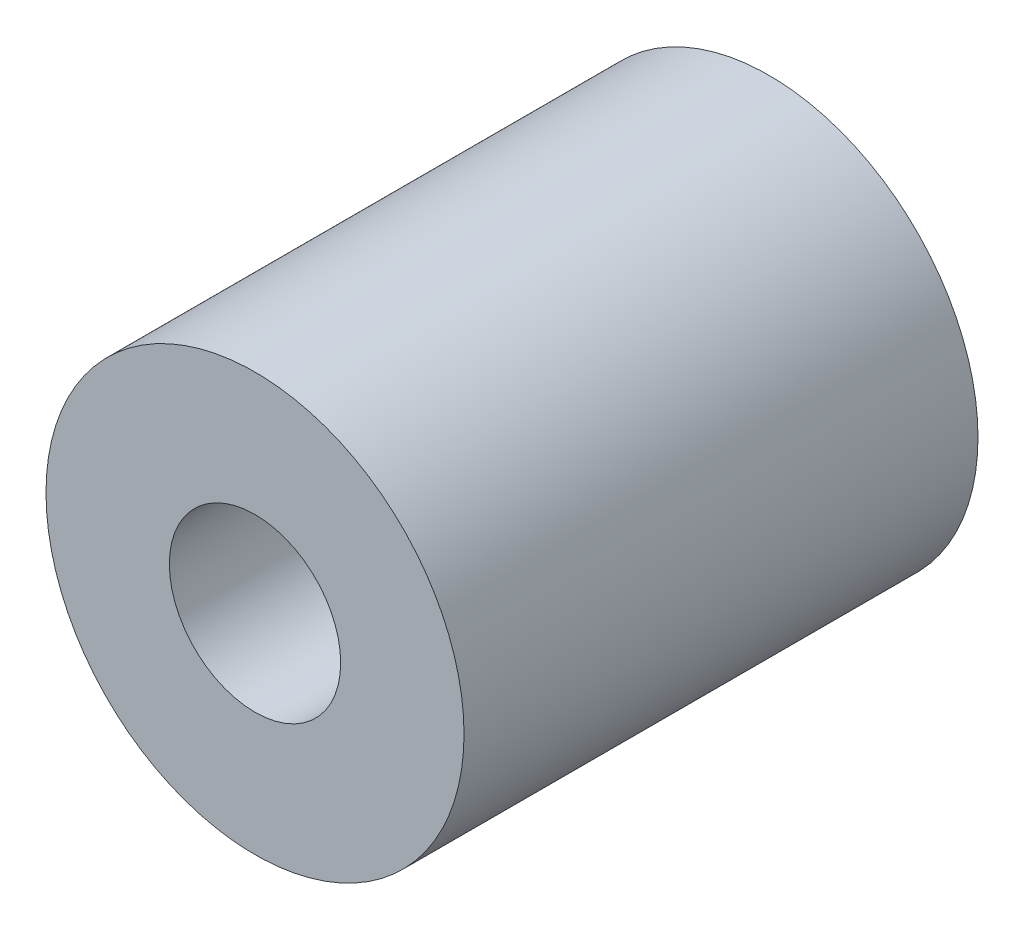
ISO-10303-21;
HEADER;
FILE_DESCRIPTION(('STEP AP214'),'2;1');
FILE_NAME('part.step','',(''),(''),'','','');
FILE_SCHEMA(('AUTOMOTIVE_DESIGN { 1 0 10303 214 1 1 1 1 }'));
ENDSEC;
DATA;
#1=APPLICATION_CONTEXT('core data for automotive mechanical design processes');
#2=APPLICATION_PROTOCOL_DEFINITION('international standard','automotive_design',2000,#1);
#3=PRODUCT_CONTEXT('',#1,'mechanical');
#4=PRODUCT('Part','Part','',(#3));
#5=PRODUCT_RELATED_PRODUCT_CATEGORY('part','',(#4));
#6=PRODUCT_DEFINITION_FORMATION('','',#4);
#7=PRODUCT_DEFINITION_CONTEXT('part definition',#1,'design');
#8=PRODUCT_DEFINITION('design','',#6,#7);
#9=PRODUCT_DEFINITION_SHAPE('','',#8);
#10=(LENGTH_UNIT() NAMED_UNIT(*) SI_UNIT(.MILLI.,.METRE.));
#11=(NAMED_UNIT(*) PLANE_ANGLE_UNIT() SI_UNIT($,.RADIAN.));
#12=(NAMED_UNIT(*) SI_UNIT($,.STERADIAN.) SOLID_ANGLE_UNIT());
#13=UNCERTAINTY_MEASURE_WITH_UNIT(LENGTH_MEASURE(1.E-05),#10,'distance_accuracy_value','');
#14=(GEOMETRIC_REPRESENTATION_CONTEXT(3) GLOBAL_UNCERTAINTY_ASSIGNED_CONTEXT((#13)) GLOBAL_UNIT_ASSIGNED_CONTEXT((#10,
#11,#12)) REPRESENTATION_CONTEXT('',''));
#15=CARTESIAN_POINT('',(0.,0.,0.));
#16=DIRECTION('',(0.,0.,1.));
#17=DIRECTION('',(1.,0.,0.));
#18=AXIS2_PLACEMENT_3D('',#15,#16,#17);
#19=CARTESIAN_POINT('',(0.,0.,38.1));
#20=DIRECTION('',(0.,0.,-1.));
#21=DIRECTION('',(-1.,0.,0.));
#22=AXIS2_PLACEMENT_3D('',#19,#20,#21);
#23=CYLINDRICAL_SURFACE('',#22,30.988);
#24=CARTESIAN_POINT('',(0.,0.,38.1));
#25=DIRECTION('',(0.,0.,1.));
#26=DIRECTION('',(1.,0.,0.));
#27=AXIS2_PLACEMENT_3D('',#24,#25,#26);
#28=CIRCLE('',#27,30.988);
#29=CARTESIAN_POINT('',(-30.988,0.,38.1));
#30=VERTEX_POINT('',#29);
#31=EDGE_CURVE('E10',#30,#30,#28,.T.);
#32=CARTESIAN_POINT('',(0.,0.,-38.1));
#33=DIRECTION('',(0.,0.,1.));
#34=DIRECTION('',(1.,0.,0.));
#35=AXIS2_PLACEMENT_3D('',#32,#33,#34);
#36=CIRCLE('',#35,30.988);
#37=CARTESIAN_POINT('',(-30.988,0.,-38.1));
#38=VERTEX_POINT('',#37);
#39=EDGE_CURVE('E35',#38,#38,#36,.T.);
#40=CARTESIAN_POINT('',(-30.988,0.,38.1));
#41=CARTESIAN_POINT('',(-30.988,0.,37.30625));
#42=CARTESIAN_POINT('',(-30.988,0.,36.5125));
#43=CARTESIAN_POINT('',(-30.988,0.,34.925));
#44=CARTESIAN_POINT('',(-30.988,0.,34.13125));
#45=CARTESIAN_POINT('',(-30.988,0.,32.54375));
#46=CARTESIAN_POINT('',(-30.988,0.,31.75));
#47=CARTESIAN_POINT('',(-30.988,0.,30.1625));
#48=CARTESIAN_POINT('',(-30.988,0.,29.36875));
#49=CARTESIAN_POINT('',(-30.988,0.,27.78125));
#50=CARTESIAN_POINT('',(-30.988,0.,26.9875));
#51=CARTESIAN_POINT('',(-30.988,0.,25.4));
#52=CARTESIAN_POINT('',(-30.988,0.,24.60625));
#53=CARTESIAN_POINT('',(-30.988,0.,23.01875));
#54=CARTESIAN_POINT('',(-30.988,0.,22.225));
#55=CARTESIAN_POINT('',(-30.988,0.,20.6375));
#56=CARTESIAN_POINT('',(-30.988,0.,19.84375));
#57=CARTESIAN_POINT('',(-30.988,0.,18.25625));
#58=CARTESIAN_POINT('',(-30.988,0.,17.4625));
#59=CARTESIAN_POINT('',(-30.988,0.,15.875));
#60=CARTESIAN_POINT('',(-30.988,0.,15.08125));
#61=CARTESIAN_POINT('',(-30.988,0.,13.49375));
#62=CARTESIAN_POINT('',(-30.988,0.,12.7));
#63=CARTESIAN_POINT('',(-30.988,0.,11.1125));
#64=CARTESIAN_POINT('',(-30.988,0.,10.31875));
#65=CARTESIAN_POINT('',(-30.988,0.,8.73124999999999));
#66=CARTESIAN_POINT('',(-30.988,0.,7.93749999999999));
#67=CARTESIAN_POINT('',(-30.988,0.,6.35));
#68=CARTESIAN_POINT('',(-30.988,0.,5.55625));
#69=CARTESIAN_POINT('',(-30.988,0.,3.96875));
#70=CARTESIAN_POINT('',(-30.988,0.,3.175));
#71=CARTESIAN_POINT('',(-30.988,0.,1.5875));
#72=CARTESIAN_POINT('',(-30.988,0.,0.793750000000001));
#73=CARTESIAN_POINT('',(-30.988,0.,-0.793750000000001));
#74=CARTESIAN_POINT('',(-30.988,0.,-1.5875));
#75=CARTESIAN_POINT('',(-30.988,0.,-3.175));
#76=CARTESIAN_POINT('',(-30.988,0.,-3.96875));
#77=CARTESIAN_POINT('',(-30.988,0.,-5.55625));
#78=CARTESIAN_POINT('',(-30.988,0.,-6.35));
#79=CARTESIAN_POINT('',(-30.988,0.,-7.93750000000001));
#80=CARTESIAN_POINT('',(-30.988,0.,-8.73125));
#81=CARTESIAN_POINT('',(-30.988,0.,-10.31875));
#82=CARTESIAN_POINT('',(-30.988,0.,-11.1125));
#83=CARTESIAN_POINT('',(-30.988,0.,-12.7));
#84=CARTESIAN_POINT('',(-30.988,0.,-13.49375));
#85=CARTESIAN_POINT('',(-30.988,0.,-15.08125));
#86=CARTESIAN_POINT('',(-30.988,0.,-15.875));
#87=CARTESIAN_POINT('',(-30.988,0.,-17.4625));
#88=CARTESIAN_POINT('',(-30.988,0.,-18.25625));
#89=CARTESIAN_POINT('',(-30.988,0.,-19.84375));
#90=CARTESIAN_POINT('',(-30.988,0.,-20.6375));
#91=CARTESIAN_POINT('',(-30.988,0.,-22.225));
#92=CARTESIAN_POINT('',(-30.988,0.,-23.01875));
#93=CARTESIAN_POINT('',(-30.988,0.,-24.60625));
#94=CARTESIAN_POINT('',(-30.988,0.,-25.4));
#95=CARTESIAN_POINT('',(-30.988,0.,-26.9875));
#96=CARTESIAN_POINT('',(-30.988,0.,-27.78125));
#97=CARTESIAN_POINT('',(-30.988,0.,-29.36875));
#98=CARTESIAN_POINT('',(-30.988,0.,-30.1625));
#99=CARTESIAN_POINT('',(-30.988,0.,-31.75));
#100=CARTESIAN_POINT('',(-30.988,0.,-32.54375));
#101=CARTESIAN_POINT('',(-30.988,0.,-34.13125));
#102=CARTESIAN_POINT('',(-30.988,0.,-34.925));
#103=CARTESIAN_POINT('',(-30.988,0.,-36.5125));
#104=CARTESIAN_POINT('',(-30.988,0.,-37.30625));
#105=CARTESIAN_POINT('',(-30.988,0.,-38.1));
#106=B_SPLINE_CURVE_WITH_KNOTS('',3,(#40,#41,#42,#43,#44,#45,#46,#47,#48,#49,#50,#51,#52,#53,
#54,#55,#56,#57,#58,#59,#60,#61,#62,#63,#64,#65,#66,#67,#68,#69,#70,#71,#72,#73,#74,#75,#76,#77,
#78,#79,#80,#81,#82,#83,#84,#85,#86,#87,#88,#89,#90,#91,#92,#93,#94,#95,#96,#97,#98,#99,#100,
#101,#102,#103,#104,#105),.UNSPECIFIED.,.F.,.F.,(4,2,2,2,2,2,2,2,2,2,2,2,2,2,2,2,2,2,2,2,2,2,2,
2,2,2,2,2,2,2,2,2,4),(0.,2.38125,4.7625,7.14375,9.52500000000001,11.90625,14.2875,16.66875,
19.05,21.43125,23.8125,26.19375,28.575,30.95625,33.3375,35.71875,38.1,40.48125,42.8625,45.24375,
47.625,50.00625,52.3875,54.76875,57.15,59.53125,61.9125,64.29375,66.675,69.05625,71.4375,
73.81875,76.2),.UNSPECIFIED.);
#107=EDGE_CURVE('BSEAM32',#30,#38,#106,.T.);
#108=ORIENTED_EDGE('',*,*,#31,.F.);
#109=ORIENTED_EDGE('',*,*,#39,.T.);
#110=ORIENTED_EDGE('',*,*,#107,.T.);
#111=ORIENTED_EDGE('',*,*,#107,.F.);
#112=EDGE_LOOP('',(#108,#110,#109,#111));
#113=FACE_BOUND('',#112,.T.);
#114=ADVANCED_FACE('F32',(#113),#23,.T.);
#115=CARTESIAN_POINT('',(0.,0.,38.1));
#116=DIRECTION('',(0.,0.,1.));
#117=DIRECTION('',(1.,0.,0.));
#118=AXIS2_PLACEMENT_3D('',#115,#116,#117);
#119=PLANE('',#118);
#120=CARTESIAN_POINT('',(0.,0.,38.1));
#121=DIRECTION('',(0.,0.,1.));
#122=DIRECTION('',(1.,0.,0.));
#123=AXIS2_PLACEMENT_3D('',#120,#121,#122);
#124=CIRCLE('',#123,12.7);
#125=CARTESIAN_POINT('',(12.7,0.,38.1));
#126=VERTEX_POINT('',#125);
#127=EDGE_CURVE('E44',#126,#126,#124,.T.);
#128=ORIENTED_EDGE('',*,*,#127,.F.);
#129=EDGE_LOOP('',(#128));
#130=FACE_BOUND('',#129,.T.);
#131=ORIENTED_EDGE('',*,*,#31,.T.);
#132=EDGE_LOOP('',(#131));
#133=FACE_BOUND('',#132,.T.);
#134=ADVANCED_FACE('F59',(#130,#133),#119,.T.);
#135=CARTESIAN_POINT('',(0.,0.,-38.1));
#136=DIRECTION('',(0.,0.,1.));
#137=DIRECTION('',(1.,0.,0.));
#138=AXIS2_PLACEMENT_3D('',#135,#136,#137);
#139=PLANE('',#138);
#140=ORIENTED_EDGE('',*,*,#39,.F.);
#141=EDGE_LOOP('',(#140));
#142=FACE_BOUND('',#141,.T.);
#143=ADVANCED_FACE('F55',(#142),#139,.F.);
#144=CARTESIAN_POINT('',(0.,0.,12.7));
#145=DIRECTION('',(0.,0.,1.));
#146=DIRECTION('',(1.,0.,0.));
#147=AXIS2_PLACEMENT_3D('',#144,#145,#146);
#148=CYLINDRICAL_SURFACE('',#147,12.7);
#149=CARTESIAN_POINT('',(0.,0.,12.7));
#150=DIRECTION('',(0.,0.,1.));
#151=DIRECTION('',(1.,0.,0.));
#152=AXIS2_PLACEMENT_3D('',#149,#150,#151);
#153=CIRCLE('',#152,12.7);
#154=CARTESIAN_POINT('',(12.7,0.,12.7));
#155=VERTEX_POINT('',#154);
#156=EDGE_CURVE('E42',#155,#155,#153,.T.);
#157=ORIENTED_EDGE('',*,*,#156,.F.);
#158=EDGE_LOOP('',(#157));
#159=FACE_BOUND('',#158,.T.);
#160=ORIENTED_EDGE('',*,*,#127,.T.);
#161=EDGE_LOOP('',(#160));
#162=FACE_BOUND('',#161,.T.);
#163=ADVANCED_FACE('F52',(#159,#162),#148,.F.);
#164=CARTESIAN_POINT('',(0.,0.,12.7));
#165=DIRECTION('',(0.,0.,1.));
#166=DIRECTION('',(1.,0.,0.));
#167=AXIS2_PLACEMENT_3D('',#164,#165,#166);
#168=PLANE('',#167);
#169=ORIENTED_EDGE('',*,*,#156,.T.);
#170=EDGE_LOOP('',(#169));
#171=FACE_BOUND('',#170,.T.);
#172=ADVANCED_FACE('F50',(#171),#168,.T.);
#173=CLOSED_SHELL('',(#114,#134,#143,#163,#172));
#174=MANIFOLD_SOLID_BREP('B2',#173);
#175=ADVANCED_BREP_SHAPE_REPRESENTATION('',(#18,#174),#14);
#176=SHAPE_DEFINITION_REPRESENTATION(#9,#175);
ENDSEC;
END-ISO-10303-21;
